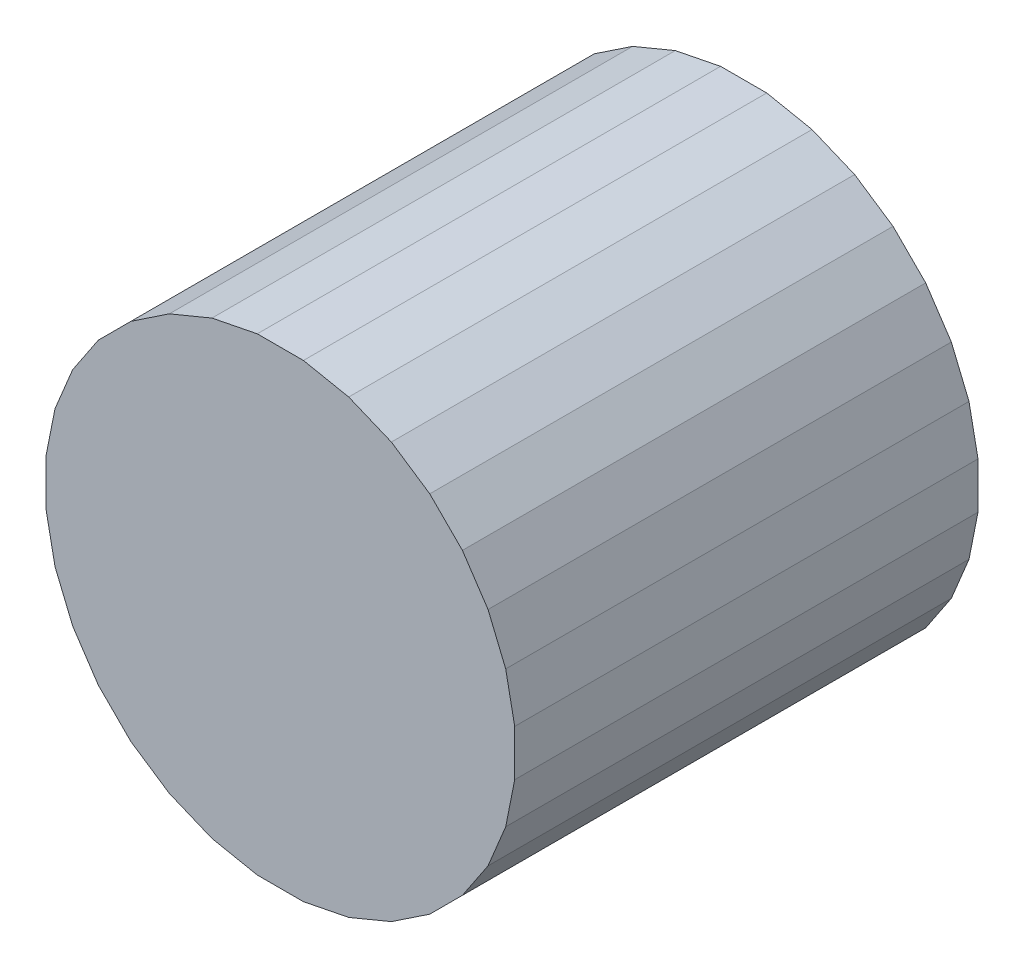
ISO-10303-21;
HEADER;
FILE_DESCRIPTION(('STEP AP214'),'2;1');
FILE_NAME('part.step','',(''),(''),'','','');
FILE_SCHEMA(('AUTOMOTIVE_DESIGN { 1 0 10303 214 1 1 1 1 }'));
ENDSEC;
DATA;
#1=APPLICATION_CONTEXT('core data for automotive mechanical design processes');
#2=APPLICATION_PROTOCOL_DEFINITION('international standard','automotive_design',2000,#1);
#3=PRODUCT_CONTEXT('',#1,'mechanical');
#4=PRODUCT('Part','Part','',(#3));
#5=PRODUCT_RELATED_PRODUCT_CATEGORY('part','',(#4));
#6=PRODUCT_DEFINITION_FORMATION('','',#4);
#7=PRODUCT_DEFINITION_CONTEXT('part definition',#1,'design');
#8=PRODUCT_DEFINITION('design','',#6,#7);
#9=PRODUCT_DEFINITION_SHAPE('','',#8);
#10=(LENGTH_UNIT() NAMED_UNIT(*) SI_UNIT(.MILLI.,.METRE.));
#11=(NAMED_UNIT(*) PLANE_ANGLE_UNIT() SI_UNIT($,.RADIAN.));
#12=(NAMED_UNIT(*) SI_UNIT($,.STERADIAN.) SOLID_ANGLE_UNIT());
#13=UNCERTAINTY_MEASURE_WITH_UNIT(LENGTH_MEASURE(1.E-05),#10,'distance_accuracy_value','');
#14=(GEOMETRIC_REPRESENTATION_CONTEXT(3) GLOBAL_UNCERTAINTY_ASSIGNED_CONTEXT((#13)) GLOBAL_UNIT_ASSIGNED_CONTEXT((#10,
#11,#12)) REPRESENTATION_CONTEXT('',''));
#15=CARTESIAN_POINT('',(0.,0.,0.));
#16=DIRECTION('',(0.,0.,1.));
#17=DIRECTION('',(1.,0.,0.));
#18=AXIS2_PLACEMENT_3D('',#15,#16,#17);
#19=CARTESIAN_POINT('',(0.15818358,1.606042,0.));
#20=DIRECTION('',(0.19508309397506,0.980786718122303,0.));
#21=DIRECTION('',(-0.980786718122303,0.19508309397506,0.));
#22=AXIS2_PLACEMENT_3D('',#19,#20,#21);
#23=PLANE('',#22);
#24=DIRECTION('',(0.,0.,1.));
#25=VECTOR('',#24,1.);
#26=CARTESIAN_POINT('',(0.46846744,1.54432508,0.));
#27=LINE('',#26,#25);
#28=CARTESIAN_POINT('',(0.468467440000009,1.54432508000005,0.));
#29=VERTEX_POINT('',#28);
#30=CARTESIAN_POINT('',(0.468467440000009,1.54432508000005,3.175));
#31=VERTEX_POINT('',#30);
#32=EDGE_CURVE('E243',#29,#31,#27,.T.);
#33=ORIENTED_EDGE('',*,*,#32,.F.);
#34=DIRECTION('',(-0.980786718122303,0.19508309397506,0.));
#35=VECTOR('',#34,1.);
#36=CARTESIAN_POINT('',(0.15818358,1.606042,0.));
#37=LINE('',#36,#35);
#38=CARTESIAN_POINT('',(0.15818358,1.606042,0.));
#39=VERTEX_POINT('',#38);
#40=EDGE_CURVE('E233',#29,#39,#37,.T.);
#41=ORIENTED_EDGE('',*,*,#40,.T.);
#42=DIRECTION('',(0.,0.,1.));
#43=VECTOR('',#42,1.);
#44=CARTESIAN_POINT('',(0.15818358,1.606042,0.));
#45=LINE('',#44,#43);
#46=CARTESIAN_POINT('',(0.15818358,1.606042,3.175));
#47=VERTEX_POINT('',#46);
#48=EDGE_CURVE('E20',#39,#47,#45,.T.);
#49=ORIENTED_EDGE('',*,*,#48,.T.);
#50=DIRECTION('',(-0.980786718122303,0.19508309397506,0.));
#51=VECTOR('',#50,1.);
#52=CARTESIAN_POINT('',(0.15818358,1.606042,3.175));
#53=LINE('',#52,#51);
#54=EDGE_CURVE('E236',#47,#31,#53,.F.);
#55=ORIENTED_EDGE('',*,*,#54,.T.);
#56=EDGE_LOOP('',(#33,#41,#49,#55));
#57=FACE_BOUND('',#56,.T.);
#58=ADVANCED_FACE('F17',(#57),#23,.T.);
#59=CARTESIAN_POINT('',(-0.15818104,1.606042,0.));
#60=DIRECTION('',(0.,1.,0.));
#61=DIRECTION('',(0.,0.,1.));
#62=AXIS2_PLACEMENT_3D('',#59,#60,#61);
#63=PLANE('',#62);
#64=DIRECTION('',(1.,0.,0.));
#65=VECTOR('',#64,1.);
#66=CARTESIAN_POINT('',(-0.15818104,1.606042,3.175));
#67=LINE('',#66,#65);
#68=CARTESIAN_POINT('',(-0.158181039999995,1.60604199999998,3.175));
#69=VERTEX_POINT('',#68);
#70=EDGE_CURVE('E225',#69,#47,#67,.T.);
#71=ORIENTED_EDGE('',*,*,#70,.T.);
#72=ORIENTED_EDGE('',*,*,#48,.F.);
#73=DIRECTION('',(1.,0.,0.));
#74=VECTOR('',#73,1.);
#75=CARTESIAN_POINT('',(-0.15818104,1.606042,0.));
#76=LINE('',#75,#74);
#77=CARTESIAN_POINT('',(-0.158181039999995,1.60604199999998,0.));
#78=VERTEX_POINT('',#77);
#79=EDGE_CURVE('E220',#39,#78,#76,.F.);
#80=ORIENTED_EDGE('',*,*,#79,.T.);
#81=DIRECTION('',(0.,0.,1.));
#82=VECTOR('',#81,1.);
#83=CARTESIAN_POINT('',(-0.158181039999982,1.60604199999991,0.));
#84=LINE('',#83,#82);
#85=EDGE_CURVE('E231',#69,#78,#84,.F.);
#86=ORIENTED_EDGE('',*,*,#85,.F.);
#87=EDGE_LOOP('',(#71,#72,#80,#86));
#88=FACE_BOUND('',#87,.T.);
#89=ADVANCED_FACE('F227',(#88),#63,.T.);
#90=CARTESIAN_POINT('',(0.46846744,1.54432508,0.));
#91=DIRECTION('',(0.38269049889006,0.923876605429144,0.));
#92=DIRECTION('',(-0.923876605429144,0.38269049889006,0.));
#93=AXIS2_PLACEMENT_3D('',#90,#91,#92);
#94=PLANE('',#93);
#95=DIRECTION('',(0.,0.,1.));
#96=VECTOR('',#95,1.);
#97=CARTESIAN_POINT('',(0.76074778,1.42325598,0.));
#98=LINE('',#97,#96);
#99=CARTESIAN_POINT('',(0.760747780000001,1.42325598,0.));
#100=VERTEX_POINT('',#99);
#101=CARTESIAN_POINT('',(0.760747780000001,1.42325598,3.175));
#102=VERTEX_POINT('',#101);
#103=EDGE_CURVE('E257',#100,#102,#98,.T.);
#104=ORIENTED_EDGE('',*,*,#103,.F.);
#105=DIRECTION('',(-0.923876605429144,0.38269049889006,0.));
#106=VECTOR('',#105,1.);
#107=CARTESIAN_POINT('',(0.46846744,1.54432508,0.));
#108=LINE('',#107,#106);
#109=EDGE_CURVE('E250',#100,#29,#108,.T.);
#110=ORIENTED_EDGE('',*,*,#109,.T.);
#111=ORIENTED_EDGE('',*,*,#32,.T.);
#112=DIRECTION('',(-0.923876605429144,0.38269049889006,0.));
#113=VECTOR('',#112,1.);
#114=CARTESIAN_POINT('',(0.46846744,1.54432508,3.175));
#115=LINE('',#114,#113);
#116=EDGE_CURVE('E239',#31,#102,#115,.F.);
#117=ORIENTED_EDGE('',*,*,#116,.T.);
#118=EDGE_LOOP('',(#104,#110,#111,#117));
#119=FACE_BOUND('',#118,.T.);
#120=ADVANCED_FACE('F538',(#119),#94,.T.);
#121=CARTESIAN_POINT('',(-0.4684649,1.54432508,0.));
#122=DIRECTION('',(-0.19508309397506,0.980786718122303,0.));
#123=DIRECTION('',(-0.980786718122303,-0.19508309397506,0.));
#124=AXIS2_PLACEMENT_3D('',#121,#122,#123);
#125=PLANE('',#124);
#126=ORIENTED_EDGE('',*,*,#85,.T.);
#127=DIRECTION('',(-0.980786718122303,-0.19508309397506,0.));
#128=VECTOR('',#127,1.);
#129=CARTESIAN_POINT('',(-0.4684649,1.54432508,0.));
#130=LINE('',#129,#128);
#131=CARTESIAN_POINT('',(-0.4684649,1.54432508,0.));
#132=VERTEX_POINT('',#131);
#133=EDGE_CURVE('E255',#78,#132,#130,.T.);
#134=ORIENTED_EDGE('',*,*,#133,.T.);
#135=DIRECTION('',(0.,0.,1.));
#136=VECTOR('',#135,1.);
#137=CARTESIAN_POINT('',(-0.468464899999998,1.54432508,0.));
#138=LINE('',#137,#136);
#139=CARTESIAN_POINT('',(-0.4684649,1.54432508,3.175));
#140=VERTEX_POINT('',#139);
#141=EDGE_CURVE('E268',#140,#132,#138,.F.);
#142=ORIENTED_EDGE('',*,*,#141,.F.);
#143=DIRECTION('',(-0.980786718122303,-0.19508309397506,0.));
#144=VECTOR('',#143,1.);
#145=CARTESIAN_POINT('',(-0.4684649,1.54432508,3.175));
#146=LINE('',#145,#144);
#147=EDGE_CURVE('E252',#140,#69,#146,.F.);
#148=ORIENTED_EDGE('',*,*,#147,.T.);
#149=EDGE_LOOP('',(#126,#134,#142,#148));
#150=FACE_BOUND('',#149,.T.);
#151=ADVANCED_FACE('F540',(#150),#125,.T.);
#152=CARTESIAN_POINT('',(0.76074778,1.42325598,0.));
#153=DIRECTION('',(0.55556885689429,0.831470531798435,0.));
#154=DIRECTION('',(-0.831470531798435,0.55556885689429,0.));
#155=AXIS2_PLACEMENT_3D('',#152,#153,#154);
#156=PLANE('',#155);
#157=DIRECTION('',(0.,0.,1.));
#158=VECTOR('',#157,1.);
#159=CARTESIAN_POINT('',(1.02379272,1.2474956,0.));
#160=LINE('',#159,#158);
#161=CARTESIAN_POINT('',(1.02379272000002,1.24749560000003,0.));
#162=VERTEX_POINT('',#161);
#163=CARTESIAN_POINT('',(1.02379272000002,1.24749560000003,3.175));
#164=VERTEX_POINT('',#163);
#165=EDGE_CURVE('E273',#162,#164,#160,.T.);
#166=ORIENTED_EDGE('',*,*,#165,.F.);
#167=DIRECTION('',(-0.831470531798435,0.55556885689429,0.));
#168=VECTOR('',#167,1.);
#169=CARTESIAN_POINT('',(0.76074778,1.42325598,0.));
#170=LINE('',#169,#168);
#171=EDGE_CURVE('E262',#162,#100,#170,.T.);
#172=ORIENTED_EDGE('',*,*,#171,.T.);
#173=ORIENTED_EDGE('',*,*,#103,.T.);
#174=DIRECTION('',(-0.831470531798435,0.55556885689429,0.));
#175=VECTOR('',#174,1.);
#176=CARTESIAN_POINT('',(0.76074778,1.42325598,3.175));
#177=LINE('',#176,#175);
#178=EDGE_CURVE('E260',#102,#164,#177,.F.);
#179=ORIENTED_EDGE('',*,*,#178,.T.);
#180=EDGE_LOOP('',(#166,#172,#173,#179));
#181=FACE_BOUND('',#180,.T.);
#182=ADVANCED_FACE('F535',(#181),#156,.T.);
#183=CARTESIAN_POINT('',(-0.76074524,1.42325598,0.));
#184=DIRECTION('',(-0.38269049889006,0.923876605429144,0.));
#185=DIRECTION('',(-0.923876605429144,-0.38269049889006,0.));
#186=AXIS2_PLACEMENT_3D('',#183,#184,#185);
#187=PLANE('',#186);
#188=ORIENTED_EDGE('',*,*,#141,.T.);
#189=DIRECTION('',(-0.923876605429144,-0.38269049889006,0.));
#190=VECTOR('',#189,1.);
#191=CARTESIAN_POINT('',(-0.76074524,1.42325598,0.));
#192=LINE('',#191,#190);
#193=CARTESIAN_POINT('',(-0.760745239999991,1.42325597999999,0.));
#194=VERTEX_POINT('',#193);
#195=EDGE_CURVE('E271',#132,#194,#192,.T.);
#196=ORIENTED_EDGE('',*,*,#195,.T.);
#197=DIRECTION('',(0.,0.,1.));
#198=VECTOR('',#197,1.);
#199=CARTESIAN_POINT('',(-0.760745239999962,1.42325597999994,0.));
#200=LINE('',#199,#198);
#201=CARTESIAN_POINT('',(-0.76074523999999,1.42325597999999,3.175));
#202=VERTEX_POINT('',#201);
#203=EDGE_CURVE('E284',#202,#194,#200,.F.);
#204=ORIENTED_EDGE('',*,*,#203,.F.);
#205=DIRECTION('',(-0.923876605429144,-0.38269049889006,0.));
#206=VECTOR('',#205,1.);
#207=CARTESIAN_POINT('',(-0.76074524,1.42325598,3.175));
#208=LINE('',#207,#206);
#209=EDGE_CURVE('E265',#202,#140,#208,.F.);
#210=ORIENTED_EDGE('',*,*,#209,.T.);
#211=EDGE_LOOP('',(#188,#196,#204,#210));
#212=FACE_BOUND('',#211,.T.);
#213=ADVANCED_FACE('F634',(#212),#187,.T.);
#214=CARTESIAN_POINT('',(1.02379272,1.2474956,0.));
#215=DIRECTION('',(0.707106781186548,0.707106781186548,0.));
#216=DIRECTION('',(-0.707106781186548,0.707106781186548,0.));
#217=AXIS2_PLACEMENT_3D('',#214,#215,#216);
#218=PLANE('',#217);
#219=DIRECTION('',(0.,0.,1.));
#220=VECTOR('',#219,1.);
#221=CARTESIAN_POINT('',(1.2474956,1.02379272,0.));
#222=LINE('',#221,#220);
#223=CARTESIAN_POINT('',(1.2474956,1.02379272,0.));
#224=VERTEX_POINT('',#223);
#225=CARTESIAN_POINT('',(1.2474956,1.02379272,3.175));
#226=VERTEX_POINT('',#225);
#227=EDGE_CURVE('E289',#224,#226,#222,.T.);
#228=ORIENTED_EDGE('',*,*,#227,.F.);
#229=DIRECTION('',(-0.707106781186548,0.707106781186548,0.));
#230=VECTOR('',#229,1.);
#231=CARTESIAN_POINT('',(1.02379272,1.2474956,0.));
#232=LINE('',#231,#230);
#233=EDGE_CURVE('E278',#224,#162,#232,.T.);
#234=ORIENTED_EDGE('',*,*,#233,.T.);
#235=ORIENTED_EDGE('',*,*,#165,.T.);
#236=DIRECTION('',(-0.707106781186548,0.707106781186548,0.));
#237=VECTOR('',#236,1.);
#238=CARTESIAN_POINT('',(1.02379272,1.2474956,3.175));
#239=LINE('',#238,#237);
#240=EDGE_CURVE('E276',#164,#226,#239,.F.);
#241=ORIENTED_EDGE('',*,*,#240,.T.);
#242=EDGE_LOOP('',(#228,#234,#235,#241));
#243=FACE_BOUND('',#242,.T.);
#244=ADVANCED_FACE('F532',(#243),#218,.T.);
#245=CARTESIAN_POINT('',(-1.02379018,1.2474956,0.));
#246=DIRECTION('',(-0.55556885689429,0.831470531798435,0.));
#247=DIRECTION('',(-0.831470531798435,-0.55556885689429,0.));
#248=AXIS2_PLACEMENT_3D('',#245,#246,#247);
#249=PLANE('',#248);
#250=ORIENTED_EDGE('',*,*,#203,.T.);
#251=DIRECTION('',(-0.831470531798435,-0.55556885689429,0.));
#252=VECTOR('',#251,1.);
#253=CARTESIAN_POINT('',(-1.02379018,1.2474956,0.));
#254=LINE('',#253,#252);
#255=CARTESIAN_POINT('',(-1.02379018,1.2474956,0.));
#256=VERTEX_POINT('',#255);
#257=EDGE_CURVE('E287',#194,#256,#254,.T.);
#258=ORIENTED_EDGE('',*,*,#257,.T.);
#259=DIRECTION('',(0.,0.,1.));
#260=VECTOR('',#259,1.);
#261=CARTESIAN_POINT('',(-1.02379018,1.2474956,0.));
#262=LINE('',#261,#260);
#263=CARTESIAN_POINT('',(-1.02379018,1.2474956,3.175));
#264=VERTEX_POINT('',#263);
#265=EDGE_CURVE('E300',#264,#256,#262,.F.);
#266=ORIENTED_EDGE('',*,*,#265,.F.);
#267=DIRECTION('',(-0.831470531798435,-0.55556885689429,0.));
#268=VECTOR('',#267,1.);
#269=CARTESIAN_POINT('',(-1.02379018,1.2474956,3.175));
#270=LINE('',#269,#268);
#271=EDGE_CURVE('E281',#264,#202,#270,.F.);
#272=ORIENTED_EDGE('',*,*,#271,.T.);
#273=EDGE_LOOP('',(#250,#258,#266,#272));
#274=FACE_BOUND('',#273,.T.);
#275=ADVANCED_FACE('F628',(#274),#249,.T.);
#276=CARTESIAN_POINT('',(1.2474956,1.02379272,0.));
#277=DIRECTION('',(0.831470531798435,0.55556885689429,0.));
#278=DIRECTION('',(-0.55556885689429,0.831470531798435,0.));
#279=AXIS2_PLACEMENT_3D('',#276,#277,#278);
#280=PLANE('',#279);
#281=DIRECTION('',(0.,0.,1.));
#282=VECTOR('',#281,1.);
#283=CARTESIAN_POINT('',(1.42325598,0.76074778,0.));
#284=LINE('',#283,#282);
#285=CARTESIAN_POINT('',(1.42325597999997,0.760747779999981,0.));
#286=VERTEX_POINT('',#285);
#287=CARTESIAN_POINT('',(1.42325597999997,0.760747779999981,3.175));
#288=VERTEX_POINT('',#287);
#289=EDGE_CURVE('E305',#286,#288,#284,.T.);
#290=ORIENTED_EDGE('',*,*,#289,.F.);
#291=DIRECTION('',(-0.55556885689429,0.831470531798435,0.));
#292=VECTOR('',#291,1.);
#293=CARTESIAN_POINT('',(1.2474956,1.02379272,0.));
#294=LINE('',#293,#292);
#295=EDGE_CURVE('E294',#286,#224,#294,.T.);
#296=ORIENTED_EDGE('',*,*,#295,.T.);
#297=ORIENTED_EDGE('',*,*,#227,.T.);
#298=DIRECTION('',(-0.55556885689429,0.831470531798435,0.));
#299=VECTOR('',#298,1.);
#300=CARTESIAN_POINT('',(1.2474956,1.02379272,3.175));
#301=LINE('',#300,#299);
#302=EDGE_CURVE('E292',#226,#288,#301,.F.);
#303=ORIENTED_EDGE('',*,*,#302,.T.);
#304=EDGE_LOOP('',(#290,#296,#297,#303));
#305=FACE_BOUND('',#304,.T.);
#306=ADVANCED_FACE('F530',(#305),#280,.T.);
#307=CARTESIAN_POINT('',(-1.24749306,1.02379272,0.));
#308=DIRECTION('',(-0.707106781186548,0.707106781186548,0.));
#309=DIRECTION('',(-0.707106781186548,-0.707106781186548,0.));
#310=AXIS2_PLACEMENT_3D('',#307,#308,#309);
#311=PLANE('',#310);
#312=ORIENTED_EDGE('',*,*,#265,.T.);
#313=DIRECTION('',(-0.707106781186548,-0.707106781186548,0.));
#314=VECTOR('',#313,1.);
#315=CARTESIAN_POINT('',(-1.24749306,1.02379272,0.));
#316=LINE('',#315,#314);
#317=CARTESIAN_POINT('',(-1.24749306000001,1.02379272000001,0.));
#318=VERTEX_POINT('',#317);
#319=EDGE_CURVE('E303',#256,#318,#316,.T.);
#320=ORIENTED_EDGE('',*,*,#319,.T.);
#321=DIRECTION('',(0.,0.,1.));
#322=VECTOR('',#321,1.);
#323=CARTESIAN_POINT('',(-1.24749306000006,1.02379272000004,0.));
#324=LINE('',#323,#322);
#325=CARTESIAN_POINT('',(-1.24749306000001,1.02379272000001,3.175));
#326=VERTEX_POINT('',#325);
#327=EDGE_CURVE('E316',#326,#318,#324,.F.);
#328=ORIENTED_EDGE('',*,*,#327,.F.);
#329=DIRECTION('',(-0.707106781186548,-0.707106781186548,0.));
#330=VECTOR('',#329,1.);
#331=CARTESIAN_POINT('',(-1.24749306,1.02379272,3.175));
#332=LINE('',#331,#330);
#333=EDGE_CURVE('E297',#326,#264,#332,.F.);
#334=ORIENTED_EDGE('',*,*,#333,.T.);
#335=EDGE_LOOP('',(#312,#320,#328,#334));
#336=FACE_BOUND('',#335,.T.);
#337=ADVANCED_FACE('F622',(#336),#311,.T.);
#338=CARTESIAN_POINT('',(1.42325598,0.76074778,0.));
#339=DIRECTION('',(0.923876605429144,0.38269049889006,0.));
#340=DIRECTION('',(-0.38269049889006,0.923876605429144,0.));
#341=AXIS2_PLACEMENT_3D('',#338,#339,#340);
#342=PLANE('',#341);
#343=DIRECTION('',(0.,0.,1.));
#344=VECTOR('',#343,1.);
#345=CARTESIAN_POINT('',(1.54432508,0.46846744,0.));
#346=LINE('',#345,#344);
#347=CARTESIAN_POINT('',(1.54432508,0.468467439999998,0.));
#348=VERTEX_POINT('',#347);
#349=CARTESIAN_POINT('',(1.54432508,0.468467439999998,3.175));
#350=VERTEX_POINT('',#349);
#351=EDGE_CURVE('E321',#348,#350,#346,.T.);
#352=ORIENTED_EDGE('',*,*,#351,.F.);
#353=DIRECTION('',(-0.38269049889006,0.923876605429144,0.));
#354=VECTOR('',#353,1.);
#355=CARTESIAN_POINT('',(1.42325598,0.76074778,0.));
#356=LINE('',#355,#354);
#357=EDGE_CURVE('E310',#348,#286,#356,.T.);
#358=ORIENTED_EDGE('',*,*,#357,.T.);
#359=ORIENTED_EDGE('',*,*,#289,.T.);
#360=DIRECTION('',(-0.38269049889006,0.923876605429144,0.));
#361=VECTOR('',#360,1.);
#362=CARTESIAN_POINT('',(1.42325598,0.76074778,3.175));
#363=LINE('',#362,#361);
#364=EDGE_CURVE('E308',#288,#350,#363,.F.);
#365=ORIENTED_EDGE('',*,*,#364,.T.);
#366=EDGE_LOOP('',(#352,#358,#359,#365));
#367=FACE_BOUND('',#366,.T.);
#368=ADVANCED_FACE('F525',(#367),#342,.T.);
#369=CARTESIAN_POINT('',(-1.42325344,0.76074778,0.));
#370=DIRECTION('',(-0.831470531798435,0.55556885689429,0.));
#371=DIRECTION('',(-0.55556885689429,-0.831470531798435,0.));
#372=AXIS2_PLACEMENT_3D('',#369,#370,#371);
#373=PLANE('',#372);
#374=ORIENTED_EDGE('',*,*,#327,.T.);
#375=DIRECTION('',(-0.55556885689429,-0.831470531798435,0.));
#376=VECTOR('',#375,1.);
#377=CARTESIAN_POINT('',(-1.42325344,0.76074778,0.));
#378=LINE('',#377,#376);
#379=CARTESIAN_POINT('',(-1.42325344,0.760747780000001,0.));
#380=VERTEX_POINT('',#379);
#381=EDGE_CURVE('E319',#318,#380,#378,.T.);
#382=ORIENTED_EDGE('',*,*,#381,.T.);
#383=DIRECTION('',(0.,0.,1.));
#384=VECTOR('',#383,1.);
#385=CARTESIAN_POINT('',(-1.42325344,0.760747780000002,0.));
#386=LINE('',#385,#384);
#387=CARTESIAN_POINT('',(-1.42325344,0.760747780000001,3.175));
#388=VERTEX_POINT('',#387);
#389=EDGE_CURVE('E333',#388,#380,#386,.F.);
#390=ORIENTED_EDGE('',*,*,#389,.F.);
#391=DIRECTION('',(-0.55556885689429,-0.831470531798435,0.));
#392=VECTOR('',#391,1.);
#393=CARTESIAN_POINT('',(-1.42325344,0.76074778,3.175));
#394=LINE('',#393,#392);
#395=EDGE_CURVE('E313',#388,#326,#394,.F.);
#396=ORIENTED_EDGE('',*,*,#395,.T.);
#397=EDGE_LOOP('',(#374,#382,#390,#396));
#398=FACE_BOUND('',#397,.T.);
#399=ADVANCED_FACE('F616',(#398),#373,.T.);
#400=CARTESIAN_POINT('',(1.54432508,0.46846744,0.));
#401=DIRECTION('',(0.980786718122303,0.19508309397506,0.));
#402=DIRECTION('',(-0.19508309397506,0.980786718122303,0.));
#403=AXIS2_PLACEMENT_3D('',#400,#401,#402);
#404=PLANE('',#403);
#405=DIRECTION('',(0.,0.,-1.));
#406=VECTOR('',#405,1.);
#407=CARTESIAN_POINT('',(1.606042,0.15818358,0.));
#408=LINE('',#407,#406);
#409=CARTESIAN_POINT('',(1.60604199999995,0.158183579999991,0.));
#410=VERTEX_POINT('',#409);
#411=CARTESIAN_POINT('',(1.60604199999995,0.158183579999991,3.175));
#412=VERTEX_POINT('',#411);
#413=EDGE_CURVE('E338',#410,#412,#408,.F.);
#414=ORIENTED_EDGE('',*,*,#413,.F.);
#415=DIRECTION('',(-0.19508309397506,0.980786718122303,0.));
#416=VECTOR('',#415,1.);
#417=CARTESIAN_POINT('',(1.54432508,0.46846744,0.));
#418=LINE('',#417,#416);
#419=EDGE_CURVE('E327',#410,#348,#418,.T.);
#420=ORIENTED_EDGE('',*,*,#419,.T.);
#421=ORIENTED_EDGE('',*,*,#351,.T.);
#422=DIRECTION('',(-0.19508309397506,0.980786718122303,0.));
#423=VECTOR('',#422,1.);
#424=CARTESIAN_POINT('',(1.54432508,0.46846744,3.175));
#425=LINE('',#424,#423);
#426=EDGE_CURVE('E324',#350,#412,#425,.F.);
#427=ORIENTED_EDGE('',*,*,#426,.T.);
#428=EDGE_LOOP('',(#414,#420,#421,#427));
#429=FACE_BOUND('',#428,.T.);
#430=ADVANCED_FACE('F519',(#429),#404,.T.);
#431=CARTESIAN_POINT('',(-1.54432254,0.46846744,0.));
#432=DIRECTION('',(-0.923876605429144,0.38269049889006,0.));
#433=DIRECTION('',(-0.38269049889006,-0.923876605429144,0.));
#434=AXIS2_PLACEMENT_3D('',#431,#432,#433);
#435=PLANE('',#434);
#436=ORIENTED_EDGE('',*,*,#389,.T.);
#437=DIRECTION('',(-0.38269049889006,-0.923876605429144,0.));
#438=VECTOR('',#437,1.);
#439=CARTESIAN_POINT('',(-1.54432254,0.46846744,0.));
#440=LINE('',#439,#438);
#441=CARTESIAN_POINT('',(-1.54432253999997,0.468467439999994,0.));
#442=VERTEX_POINT('',#441);
#443=EDGE_CURVE('E336',#380,#442,#440,.T.);
#444=ORIENTED_EDGE('',*,*,#443,.T.);
#445=DIRECTION('',(0.,0.,1.));
#446=VECTOR('',#445,1.);
#447=CARTESIAN_POINT('',(-1.54432253999988,0.468467439999975,0.));
#448=LINE('',#447,#446);
#449=CARTESIAN_POINT('',(-1.54432253999997,0.468467439999993,3.175));
#450=VERTEX_POINT('',#449);
#451=EDGE_CURVE('E344',#450,#442,#448,.F.);
#452=ORIENTED_EDGE('',*,*,#451,.F.);
#453=DIRECTION('',(-0.38269049889006,-0.923876605429144,0.));
#454=VECTOR('',#453,1.);
#455=CARTESIAN_POINT('',(-1.54432254,0.46846744,3.175));
#456=LINE('',#455,#454);
#457=EDGE_CURVE('E330',#450,#388,#456,.F.);
#458=ORIENTED_EDGE('',*,*,#457,.T.);
#459=EDGE_LOOP('',(#436,#444,#452,#458));
#460=FACE_BOUND('',#459,.T.);
#461=ADVANCED_FACE('F609',(#460),#435,.T.);
#462=CARTESIAN_POINT('',(-1.606042,0.15818358,0.));
#463=DIRECTION('',(-0.980785181909882,0.195090817174977,0.));
#464=DIRECTION('',(-0.195090817174977,-0.980785181909882,0.));
#465=AXIS2_PLACEMENT_3D('',#462,#463,#464);
#466=PLANE('',#465);
#467=ORIENTED_EDGE('',*,*,#451,.T.);
#468=DIRECTION('',(-0.195090817174977,-0.980785181909882,0.));
#469=VECTOR('',#468,1.);
#470=CARTESIAN_POINT('',(-1.606042,0.15818358,0.));
#471=LINE('',#470,#469);
#472=CARTESIAN_POINT('',(-1.606042,0.15818358,0.));
#473=VERTEX_POINT('',#472);
#474=EDGE_CURVE('E347',#442,#473,#471,.T.);
#475=ORIENTED_EDGE('',*,*,#474,.T.);
#476=DIRECTION('',(0.,0.,1.));
#477=VECTOR('',#476,1.);
#478=CARTESIAN_POINT('',(-1.606042,0.15818358,0.));
#479=LINE('',#478,#477);
#480=CARTESIAN_POINT('',(-1.606042,0.158183580000001,3.175));
#481=VERTEX_POINT('',#480);
#482=EDGE_CURVE('E354',#481,#473,#479,.F.);
#483=ORIENTED_EDGE('',*,*,#482,.F.);
#484=DIRECTION('',(-0.195090817174977,-0.980785181909882,0.));
#485=VECTOR('',#484,1.);
#486=CARTESIAN_POINT('',(-1.606042,0.15818358,3.175));
#487=LINE('',#486,#485);
#488=EDGE_CURVE('E341',#481,#450,#487,.F.);
#489=ORIENTED_EDGE('',*,*,#488,.T.);
#490=EDGE_LOOP('',(#467,#475,#483,#489));
#491=FACE_BOUND('',#490,.T.);
#492=ADVANCED_FACE('F606',(#491),#466,.T.);
#493=CARTESIAN_POINT('',(1.606042,0.,0.));
#494=DIRECTION('',(1.,0.,0.));
#495=DIRECTION('',(0.,0.,-1.));
#496=AXIS2_PLACEMENT_3D('',#493,#494,#495);
#497=PLANE('',#496);
#498=DIRECTION('',(0.,0.,1.));
#499=VECTOR('',#498,1.);
#500=CARTESIAN_POINT('',(1.606042,-0.15818104,0.));
#501=LINE('',#500,#499);
#502=CARTESIAN_POINT('',(1.606042,-0.15818104,0.));
#503=VERTEX_POINT('',#502);
#504=CARTESIAN_POINT('',(1.606042,-0.15818104,3.175));
#505=VERTEX_POINT('',#504);
#506=EDGE_CURVE('E357',#503,#505,#501,.T.);
#507=ORIENTED_EDGE('',*,*,#506,.F.);
#508=DIRECTION('',(0.,1.,0.));
#509=VECTOR('',#508,1.);
#510=CARTESIAN_POINT('',(1.606042,0.,0.));
#511=LINE('',#510,#509);
#512=EDGE_CURVE('E352',#503,#410,#511,.T.);
#513=ORIENTED_EDGE('',*,*,#512,.T.);
#514=ORIENTED_EDGE('',*,*,#413,.T.);
#515=DIRECTION('',(0.,1.,0.));
#516=VECTOR('',#515,1.);
#517=CARTESIAN_POINT('',(1.606042,0.,3.175));
#518=LINE('',#517,#516);
#519=EDGE_CURVE('E350',#412,#505,#518,.F.);
#520=ORIENTED_EDGE('',*,*,#519,.T.);
#521=EDGE_LOOP('',(#507,#513,#514,#520));
#522=FACE_BOUND('',#521,.T.);
#523=ADVANCED_FACE('F521',(#522),#497,.T.);
#524=CARTESIAN_POINT('',(1.606042,-0.15818104,0.));
#525=DIRECTION('',(0.980786718122303,-0.19508309397506,0.));
#526=DIRECTION('',(0.19508309397506,0.980786718122303,0.));
#527=AXIS2_PLACEMENT_3D('',#524,#525,#526);
#528=PLANE('',#527);
#529=DIRECTION('',(0.,0.,1.));
#530=VECTOR('',#529,1.);
#531=CARTESIAN_POINT('',(1.54432508,-0.4684649,0.));
#532=LINE('',#531,#530);
#533=CARTESIAN_POINT('',(1.54432508000005,-0.468464900000009,0.));
#534=VERTEX_POINT('',#533);
#535=CARTESIAN_POINT('',(1.54432508000005,-0.468464900000009,3.175));
#536=VERTEX_POINT('',#535);
#537=EDGE_CURVE('E369',#534,#536,#532,.T.);
#538=ORIENTED_EDGE('',*,*,#537,.F.);
#539=DIRECTION('',(0.19508309397506,0.980786718122303,0.));
#540=VECTOR('',#539,1.);
#541=CARTESIAN_POINT('',(1.606042,-0.15818104,0.));
#542=LINE('',#541,#540);
#543=EDGE_CURVE('E362',#534,#503,#542,.T.);
#544=ORIENTED_EDGE('',*,*,#543,.T.);
#545=ORIENTED_EDGE('',*,*,#506,.T.);
#546=DIRECTION('',(0.19508309397506,0.980786718122303,0.));
#547=VECTOR('',#546,1.);
#548=CARTESIAN_POINT('',(1.606042,-0.15818104,3.175));
#549=LINE('',#548,#547);
#550=EDGE_CURVE('E360',#505,#536,#549,.F.);
#551=ORIENTED_EDGE('',*,*,#550,.T.);
#552=EDGE_LOOP('',(#538,#544,#545,#551));
#553=FACE_BOUND('',#552,.T.);
#554=ADVANCED_FACE('F512',(#553),#528,.T.);
#555=CARTESIAN_POINT('',(-1.606042,-0.15818104,0.));
#556=DIRECTION('',(-1.,0.,0.));
#557=DIRECTION('',(0.,0.,1.));
#558=AXIS2_PLACEMENT_3D('',#555,#556,#557);
#559=PLANE('',#558);
#560=DIRECTION('',(0.,1.,0.));
#561=VECTOR('',#560,1.);
#562=CARTESIAN_POINT('',(-1.606042,-0.15818104,3.175));
#563=LINE('',#562,#561);
#564=CARTESIAN_POINT('',(-1.60604200000003,-0.158181040000007,3.175));
#565=VERTEX_POINT('',#564);
#566=EDGE_CURVE('E365',#565,#481,#563,.T.);
#567=ORIENTED_EDGE('',*,*,#566,.T.);
#568=ORIENTED_EDGE('',*,*,#482,.T.);
#569=DIRECTION('',(0.,1.,0.));
#570=VECTOR('',#569,1.);
#571=CARTESIAN_POINT('',(-1.606042,-0.15818104,0.));
#572=LINE('',#571,#570);
#573=CARTESIAN_POINT('',(-1.60604200000003,-0.158181040000007,0.));
#574=VERTEX_POINT('',#573);
#575=EDGE_CURVE('E367',#473,#574,#572,.F.);
#576=ORIENTED_EDGE('',*,*,#575,.T.);
#577=DIRECTION('',(0.,0.,1.));
#578=VECTOR('',#577,1.);
#579=CARTESIAN_POINT('',(-1.60604200000012,-0.158181040000025,0.));
#580=LINE('',#579,#578);
#581=EDGE_CURVE('E380',#565,#574,#580,.F.);
#582=ORIENTED_EDGE('',*,*,#581,.F.);
#583=EDGE_LOOP('',(#567,#568,#576,#582));
#584=FACE_BOUND('',#583,.T.);
#585=ADVANCED_FACE('F598',(#584),#559,.T.);
#586=CARTESIAN_POINT('',(1.54432508,-0.4684649,0.));
#587=DIRECTION('',(0.923876605429144,-0.38269049889006,0.));
#588=DIRECTION('',(0.38269049889006,0.923876605429144,0.));
#589=AXIS2_PLACEMENT_3D('',#586,#587,#588);
#590=PLANE('',#589);
#591=DIRECTION('',(0.,0.,1.));
#592=VECTOR('',#591,1.);
#593=CARTESIAN_POINT('',(1.42325598,-0.76074524,0.));
#594=LINE('',#593,#592);
#595=CARTESIAN_POINT('',(1.42325598,-0.760745240000001,0.));
#596=VERTEX_POINT('',#595);
#597=CARTESIAN_POINT('',(1.42325598,-0.760745240000001,3.175));
#598=VERTEX_POINT('',#597);
#599=EDGE_CURVE('E385',#596,#598,#594,.T.);
#600=ORIENTED_EDGE('',*,*,#599,.F.);
#601=DIRECTION('',(0.38269049889006,0.923876605429144,0.));
#602=VECTOR('',#601,1.);
#603=CARTESIAN_POINT('',(1.54432508,-0.4684649,0.));
#604=LINE('',#603,#602);
#605=EDGE_CURVE('E374',#596,#534,#604,.T.);
#606=ORIENTED_EDGE('',*,*,#605,.T.);
#607=ORIENTED_EDGE('',*,*,#537,.T.);
#608=DIRECTION('',(0.38269049889006,0.923876605429144,0.));
#609=VECTOR('',#608,1.);
#610=CARTESIAN_POINT('',(1.54432508,-0.4684649,3.175));
#611=LINE('',#610,#609);
#612=EDGE_CURVE('E372',#536,#598,#611,.F.);
#613=ORIENTED_EDGE('',*,*,#612,.T.);
#614=EDGE_LOOP('',(#600,#606,#607,#613));
#615=FACE_BOUND('',#614,.T.);
#616=ADVANCED_FACE('F509',(#615),#590,.T.);
#617=CARTESIAN_POINT('',(-1.54432254,-0.4684649,0.));
#618=DIRECTION('',(-0.980785181909882,-0.195090817174977,0.));
#619=DIRECTION('',(0.195090817174977,-0.980785181909882,0.));
#620=AXIS2_PLACEMENT_3D('',#617,#618,#619);
#621=PLANE('',#620);
#622=ORIENTED_EDGE('',*,*,#581,.T.);
#623=DIRECTION('',(0.195090817174977,-0.980785181909882,0.));
#624=VECTOR('',#623,1.);
#625=CARTESIAN_POINT('',(-1.54432254,-0.4684649,0.));
#626=LINE('',#625,#624);
#627=CARTESIAN_POINT('',(-1.54432254,-0.4684649,0.));
#628=VERTEX_POINT('',#627);
#629=EDGE_CURVE('E383',#574,#628,#626,.T.);
#630=ORIENTED_EDGE('',*,*,#629,.T.);
#631=DIRECTION('',(0.,0.,1.));
#632=VECTOR('',#631,1.);
#633=CARTESIAN_POINT('',(-1.54432254,-0.468464899999998,0.));
#634=LINE('',#633,#632);
#635=CARTESIAN_POINT('',(-1.54432254,-0.4684649,3.175));
#636=VERTEX_POINT('',#635);
#637=EDGE_CURVE('E396',#636,#628,#634,.F.);
#638=ORIENTED_EDGE('',*,*,#637,.F.);
#639=DIRECTION('',(0.195090817174977,-0.980785181909882,0.));
#640=VECTOR('',#639,1.);
#641=CARTESIAN_POINT('',(-1.54432254,-0.4684649,3.175));
#642=LINE('',#641,#640);
#643=EDGE_CURVE('E377',#636,#565,#642,.F.);
#644=ORIENTED_EDGE('',*,*,#643,.T.);
#645=EDGE_LOOP('',(#622,#630,#638,#644));
#646=FACE_BOUND('',#645,.T.);
#647=ADVANCED_FACE('F592',(#646),#621,.T.);
#648=CARTESIAN_POINT('',(1.42325598,-0.76074524,0.));
#649=DIRECTION('',(0.831470531798435,-0.55556885689429,0.));
#650=DIRECTION('',(0.55556885689429,0.831470531798435,0.));
#651=AXIS2_PLACEMENT_3D('',#648,#649,#650);
#652=PLANE('',#651);
#653=DIRECTION('',(0.,0.,1.));
#654=VECTOR('',#653,1.);
#655=CARTESIAN_POINT('',(1.2474956,-1.02379018,0.));
#656=LINE('',#655,#654);
#657=CARTESIAN_POINT('',(1.24749560000003,-1.02379018000002,0.));
#658=VERTEX_POINT('',#657);
#659=CARTESIAN_POINT('',(1.24749560000003,-1.02379018000002,3.175));
#660=VERTEX_POINT('',#659);
#661=EDGE_CURVE('E401',#658,#660,#656,.T.);
#662=ORIENTED_EDGE('',*,*,#661,.F.);
#663=DIRECTION('',(0.55556885689429,0.831470531798435,0.));
#664=VECTOR('',#663,1.);
#665=CARTESIAN_POINT('',(1.42325598,-0.76074524,0.));
#666=LINE('',#665,#664);
#667=EDGE_CURVE('E390',#658,#596,#666,.T.);
#668=ORIENTED_EDGE('',*,*,#667,.T.);
#669=ORIENTED_EDGE('',*,*,#599,.T.);
#670=DIRECTION('',(0.55556885689429,0.831470531798435,0.));
#671=VECTOR('',#670,1.);
#672=CARTESIAN_POINT('',(1.42325598,-0.76074524,3.175));
#673=LINE('',#672,#671);
#674=EDGE_CURVE('E388',#598,#660,#673,.F.);
#675=ORIENTED_EDGE('',*,*,#674,.T.);
#676=EDGE_LOOP('',(#662,#668,#669,#675));
#677=FACE_BOUND('',#676,.T.);
#678=ADVANCED_FACE('F507',(#677),#652,.T.);
#679=CARTESIAN_POINT('',(-1.42325344,-0.76074524,0.));
#680=DIRECTION('',(-0.923876605429144,-0.38269049889006,0.));
#681=DIRECTION('',(0.38269049889006,-0.923876605429144,0.));
#682=AXIS2_PLACEMENT_3D('',#679,#680,#681);
#683=PLANE('',#682);
#684=ORIENTED_EDGE('',*,*,#637,.T.);
#685=DIRECTION('',(0.38269049889006,-0.923876605429144,0.));
#686=VECTOR('',#685,1.);
#687=CARTESIAN_POINT('',(-1.42325344,-0.76074524,0.));
#688=LINE('',#687,#686);
#689=CARTESIAN_POINT('',(-1.42325343999999,-0.760745239999991,0.));
#690=VERTEX_POINT('',#689);
#691=EDGE_CURVE('E399',#628,#690,#688,.T.);
#692=ORIENTED_EDGE('',*,*,#691,.T.);
#693=DIRECTION('',(0.,0.,1.));
#694=VECTOR('',#693,1.);
#695=CARTESIAN_POINT('',(-1.42325343999994,-0.760745239999962,0.));
#696=LINE('',#695,#694);
#697=CARTESIAN_POINT('',(-1.42325343999999,-0.760745239999992,3.175));
#698=VERTEX_POINT('',#697);
#699=EDGE_CURVE('E412',#698,#690,#696,.F.);
#700=ORIENTED_EDGE('',*,*,#699,.F.);
#701=DIRECTION('',(0.38269049889006,-0.923876605429144,0.));
#702=VECTOR('',#701,1.);
#703=CARTESIAN_POINT('',(-1.42325344,-0.76074524,3.175));
#704=LINE('',#703,#702);
#705=EDGE_CURVE('E393',#698,#636,#704,.F.);
#706=ORIENTED_EDGE('',*,*,#705,.T.);
#707=EDGE_LOOP('',(#684,#692,#700,#706));
#708=FACE_BOUND('',#707,.T.);
#709=ADVANCED_FACE('F586',(#708),#683,.T.);
#710=CARTESIAN_POINT('',(1.2474956,-1.02379018,0.));
#711=DIRECTION('',(0.707106781186548,-0.707106781186548,0.));
#712=DIRECTION('',(0.707106781186548,0.707106781186548,0.));
#713=AXIS2_PLACEMENT_3D('',#710,#711,#712);
#714=PLANE('',#713);
#715=DIRECTION('',(0.,0.,1.));
#716=VECTOR('',#715,1.);
#717=CARTESIAN_POINT('',(1.02379272,-1.24749306,0.));
#718=LINE('',#717,#716);
#719=CARTESIAN_POINT('',(1.02379272,-1.24749306,0.));
#720=VERTEX_POINT('',#719);
#721=CARTESIAN_POINT('',(1.02379272,-1.24749306,3.175));
#722=VERTEX_POINT('',#721);
#723=EDGE_CURVE('E417',#720,#722,#718,.T.);
#724=ORIENTED_EDGE('',*,*,#723,.F.);
#725=DIRECTION('',(0.707106781186548,0.707106781186548,0.));
#726=VECTOR('',#725,1.);
#727=CARTESIAN_POINT('',(1.2474956,-1.02379018,0.));
#728=LINE('',#727,#726);
#729=EDGE_CURVE('E406',#720,#658,#728,.T.);
#730=ORIENTED_EDGE('',*,*,#729,.T.);
#731=ORIENTED_EDGE('',*,*,#661,.T.);
#732=DIRECTION('',(0.707106781186548,0.707106781186548,0.));
#733=VECTOR('',#732,1.);
#734=CARTESIAN_POINT('',(1.2474956,-1.02379018,3.175));
#735=LINE('',#734,#733);
#736=EDGE_CURVE('E404',#660,#722,#735,.F.);
#737=ORIENTED_EDGE('',*,*,#736,.T.);
#738=EDGE_LOOP('',(#724,#730,#731,#737));
#739=FACE_BOUND('',#738,.T.);
#740=ADVANCED_FACE('F500',(#739),#714,.T.);
#741=CARTESIAN_POINT('',(-1.24749306,-1.02379018,0.));
#742=DIRECTION('',(-0.831470531798435,-0.55556885689429,0.));
#743=DIRECTION('',(0.55556885689429,-0.831470531798435,0.));
#744=AXIS2_PLACEMENT_3D('',#741,#742,#743);
#745=PLANE('',#744);
#746=ORIENTED_EDGE('',*,*,#699,.T.);
#747=DIRECTION('',(0.55556885689429,-0.831470531798435,0.));
#748=VECTOR('',#747,1.);
#749=CARTESIAN_POINT('',(-1.24749306,-1.02379018,0.));
#750=LINE('',#749,#748);
#751=CARTESIAN_POINT('',(-1.24749306,-1.02379018,0.));
#752=VERTEX_POINT('',#751);
#753=EDGE_CURVE('E415',#690,#752,#750,.T.);
#754=ORIENTED_EDGE('',*,*,#753,.T.);
#755=DIRECTION('',(0.,0.,1.));
#756=VECTOR('',#755,1.);
#757=CARTESIAN_POINT('',(-1.24749306,-1.02379018,0.));
#758=LINE('',#757,#756);
#759=CARTESIAN_POINT('',(-1.24749306,-1.02379018,3.175));
#760=VERTEX_POINT('',#759);
#761=EDGE_CURVE('E428',#760,#752,#758,.F.);
#762=ORIENTED_EDGE('',*,*,#761,.F.);
#763=DIRECTION('',(0.55556885689429,-0.831470531798435,0.));
#764=VECTOR('',#763,1.);
#765=CARTESIAN_POINT('',(-1.24749306,-1.02379018,3.175));
#766=LINE('',#765,#764);
#767=EDGE_CURVE('E409',#760,#698,#766,.F.);
#768=ORIENTED_EDGE('',*,*,#767,.T.);
#769=EDGE_LOOP('',(#746,#754,#762,#768));
#770=FACE_BOUND('',#769,.T.);
#771=ADVANCED_FACE('F580',(#770),#745,.T.);
#772=CARTESIAN_POINT('',(1.02379272,-1.24749306,0.));
#773=DIRECTION('',(0.55556885689429,-0.831470531798435,0.));
#774=DIRECTION('',(0.831470531798435,0.55556885689429,0.));
#775=AXIS2_PLACEMENT_3D('',#772,#773,#774);
#776=PLANE('',#775);
#777=DIRECTION('',(0.,0.,1.));
#778=VECTOR('',#777,1.);
#779=CARTESIAN_POINT('',(0.76074778,-1.42325344,0.));
#780=LINE('',#779,#778);
#781=CARTESIAN_POINT('',(0.760747779999982,-1.42325343999997,0.));
#782=VERTEX_POINT('',#781);
#783=CARTESIAN_POINT('',(0.760747779999982,-1.42325343999997,3.175));
#784=VERTEX_POINT('',#783);
#785=EDGE_CURVE('E433',#782,#784,#780,.T.);
#786=ORIENTED_EDGE('',*,*,#785,.F.);
#787=DIRECTION('',(0.831470531798435,0.55556885689429,0.));
#788=VECTOR('',#787,1.);
#789=CARTESIAN_POINT('',(1.02379272,-1.24749306,0.));
#790=LINE('',#789,#788);
#791=EDGE_CURVE('E422',#782,#720,#790,.T.);
#792=ORIENTED_EDGE('',*,*,#791,.T.);
#793=ORIENTED_EDGE('',*,*,#723,.T.);
#794=DIRECTION('',(0.831470531798435,0.55556885689429,0.));
#795=VECTOR('',#794,1.);
#796=CARTESIAN_POINT('',(1.02379272,-1.24749306,3.175));
#797=LINE('',#796,#795);
#798=EDGE_CURVE('E420',#722,#784,#797,.F.);
#799=ORIENTED_EDGE('',*,*,#798,.T.);
#800=EDGE_LOOP('',(#786,#792,#793,#799));
#801=FACE_BOUND('',#800,.T.);
#802=ADVANCED_FACE('F497',(#801),#776,.T.);
#803=CARTESIAN_POINT('',(-1.02379018,-1.24749306,0.));
#804=DIRECTION('',(-0.707106781186548,-0.707106781186548,0.));
#805=DIRECTION('',(0.707106781186548,-0.707106781186548,0.));
#806=AXIS2_PLACEMENT_3D('',#803,#804,#805);
#807=PLANE('',#806);
#808=ORIENTED_EDGE('',*,*,#761,.T.);
#809=DIRECTION('',(0.707106781186548,-0.707106781186548,0.));
#810=VECTOR('',#809,1.);
#811=CARTESIAN_POINT('',(-1.02379018,-1.24749306,0.));
#812=LINE('',#811,#810);
#813=CARTESIAN_POINT('',(-1.02379018000001,-1.24749306000001,0.));
#814=VERTEX_POINT('',#813);
#815=EDGE_CURVE('E431',#752,#814,#812,.T.);
#816=ORIENTED_EDGE('',*,*,#815,.T.);
#817=DIRECTION('',(0.,0.,1.));
#818=VECTOR('',#817,1.);
#819=CARTESIAN_POINT('',(-1.02379018000004,-1.24749306000006,0.));
#820=LINE('',#819,#818);
#821=CARTESIAN_POINT('',(-1.02379018000001,-1.24749306000002,3.175));
#822=VERTEX_POINT('',#821);
#823=EDGE_CURVE('E444',#822,#814,#820,.F.);
#824=ORIENTED_EDGE('',*,*,#823,.F.);
#825=DIRECTION('',(0.707106781186548,-0.707106781186548,0.));
#826=VECTOR('',#825,1.);
#827=CARTESIAN_POINT('',(-1.02379018,-1.24749306,3.175));
#828=LINE('',#827,#826);
#829=EDGE_CURVE('E425',#822,#760,#828,.F.);
#830=ORIENTED_EDGE('',*,*,#829,.T.);
#831=EDGE_LOOP('',(#808,#816,#824,#830));
#832=FACE_BOUND('',#831,.T.);
#833=ADVANCED_FACE('F574',(#832),#807,.T.);
#834=CARTESIAN_POINT('',(0.76074778,-1.42325344,0.));
#835=DIRECTION('',(0.38269049889006,-0.923876605429144,0.));
#836=DIRECTION('',(0.923876605429144,0.38269049889006,0.));
#837=AXIS2_PLACEMENT_3D('',#834,#835,#836);
#838=PLANE('',#837);
#839=DIRECTION('',(0.,0.,1.));
#840=VECTOR('',#839,1.);
#841=CARTESIAN_POINT('',(0.46846744,-1.54432254,0.));
#842=LINE('',#841,#840);
#843=CARTESIAN_POINT('',(0.468467439999999,-1.54432254,0.));
#844=VERTEX_POINT('',#843);
#845=CARTESIAN_POINT('',(0.468467439999999,-1.54432254,3.175));
#846=VERTEX_POINT('',#845);
#847=EDGE_CURVE('E449',#844,#846,#842,.T.);
#848=ORIENTED_EDGE('',*,*,#847,.F.);
#849=DIRECTION('',(0.923876605429144,0.38269049889006,0.));
#850=VECTOR('',#849,1.);
#851=CARTESIAN_POINT('',(0.76074778,-1.42325344,0.));
#852=LINE('',#851,#850);
#853=EDGE_CURVE('E438',#844,#782,#852,.T.);
#854=ORIENTED_EDGE('',*,*,#853,.T.);
#855=ORIENTED_EDGE('',*,*,#785,.T.);
#856=DIRECTION('',(0.923876605429144,0.38269049889006,0.));
#857=VECTOR('',#856,1.);
#858=CARTESIAN_POINT('',(0.76074778,-1.42325344,3.175));
#859=LINE('',#858,#857);
#860=EDGE_CURVE('E436',#784,#846,#859,.F.);
#861=ORIENTED_EDGE('',*,*,#860,.T.);
#862=EDGE_LOOP('',(#848,#854,#855,#861));
#863=FACE_BOUND('',#862,.T.);
#864=ADVANCED_FACE('F495',(#863),#838,.T.);
#865=CARTESIAN_POINT('',(-0.76074524,-1.42325344,0.));
#866=DIRECTION('',(-0.55556885689429,-0.831470531798435,0.));
#867=DIRECTION('',(0.831470531798435,-0.55556885689429,0.));
#868=AXIS2_PLACEMENT_3D('',#865,#866,#867);
#869=PLANE('',#868);
#870=ORIENTED_EDGE('',*,*,#823,.T.);
#871=DIRECTION('',(0.831470531798435,-0.55556885689429,0.));
#872=VECTOR('',#871,1.);
#873=CARTESIAN_POINT('',(-0.76074524,-1.42325344,0.));
#874=LINE('',#873,#872);
#875=CARTESIAN_POINT('',(-0.760745240000001,-1.42325344,0.));
#876=VERTEX_POINT('',#875);
#877=EDGE_CURVE('E447',#814,#876,#874,.T.);
#878=ORIENTED_EDGE('',*,*,#877,.T.);
#879=DIRECTION('',(0.,0.,1.));
#880=VECTOR('',#879,1.);
#881=CARTESIAN_POINT('',(-0.760745240000002,-1.42325344,0.));
#882=LINE('',#881,#880);
#883=CARTESIAN_POINT('',(-0.760745240000001,-1.42325344,3.175));
#884=VERTEX_POINT('',#883);
#885=EDGE_CURVE('E461',#884,#876,#882,.F.);
#886=ORIENTED_EDGE('',*,*,#885,.F.);
#887=DIRECTION('',(0.831470531798435,-0.55556885689429,0.));
#888=VECTOR('',#887,1.);
#889=CARTESIAN_POINT('',(-0.76074524,-1.42325344,3.175));
#890=LINE('',#889,#888);
#891=EDGE_CURVE('E441',#884,#822,#890,.F.);
#892=ORIENTED_EDGE('',*,*,#891,.T.);
#893=EDGE_LOOP('',(#870,#878,#886,#892));
#894=FACE_BOUND('',#893,.T.);
#895=ADVANCED_FACE('F568',(#894),#869,.T.);
#896=CARTESIAN_POINT('',(0.46846744,-1.54432254,0.));
#897=DIRECTION('',(0.195090817174977,-0.980785181909882,0.));
#898=DIRECTION('',(0.980785181909882,0.195090817174977,0.));
#899=AXIS2_PLACEMENT_3D('',#896,#897,#898);
#900=PLANE('',#899);
#901=DIRECTION('',(0.,0.,-1.));
#902=VECTOR('',#901,1.);
#903=CARTESIAN_POINT('',(0.15818358,-1.606042,0.));
#904=LINE('',#903,#902);
#905=CARTESIAN_POINT('',(0.158183580000012,-1.60604200000006,0.));
#906=VERTEX_POINT('',#905);
#907=CARTESIAN_POINT('',(0.158183580000012,-1.60604200000006,3.175));
#908=VERTEX_POINT('',#907);
#909=EDGE_CURVE('E466',#906,#908,#904,.F.);
#910=ORIENTED_EDGE('',*,*,#909,.F.);
#911=DIRECTION('',(0.980785181909882,0.195090817174977,0.));
#912=VECTOR('',#911,1.);
#913=CARTESIAN_POINT('',(0.46846744,-1.54432254,0.));
#914=LINE('',#913,#912);
#915=EDGE_CURVE('E455',#906,#844,#914,.T.);
#916=ORIENTED_EDGE('',*,*,#915,.T.);
#917=ORIENTED_EDGE('',*,*,#847,.T.);
#918=DIRECTION('',(0.980785181909882,0.195090817174977,0.));
#919=VECTOR('',#918,1.);
#920=CARTESIAN_POINT('',(0.46846744,-1.54432254,3.175));
#921=LINE('',#920,#919);
#922=EDGE_CURVE('E452',#846,#908,#921,.F.);
#923=ORIENTED_EDGE('',*,*,#922,.T.);
#924=EDGE_LOOP('',(#910,#916,#917,#923));
#925=FACE_BOUND('',#924,.T.);
#926=ADVANCED_FACE('F488',(#925),#900,.T.);
#927=CARTESIAN_POINT('',(-0.4684649,-1.54432254,0.));
#928=DIRECTION('',(-0.38269049889006,-0.923876605429144,0.));
#929=DIRECTION('',(0.923876605429144,-0.38269049889006,0.));
#930=AXIS2_PLACEMENT_3D('',#927,#928,#929);
#931=PLANE('',#930);
#932=ORIENTED_EDGE('',*,*,#885,.T.);
#933=DIRECTION('',(0.923876605429144,-0.38269049889006,0.));
#934=VECTOR('',#933,1.);
#935=CARTESIAN_POINT('',(-0.4684649,-1.54432254,0.));
#936=LINE('',#935,#934);
#937=CARTESIAN_POINT('',(-0.468464899999994,-1.54432253999997,0.));
#938=VERTEX_POINT('',#937);
#939=EDGE_CURVE('E464',#876,#938,#936,.T.);
#940=ORIENTED_EDGE('',*,*,#939,.T.);
#941=DIRECTION('',(0.,0.,1.));
#942=VECTOR('',#941,1.);
#943=CARTESIAN_POINT('',(-0.468464899999975,-1.54432253999988,0.));
#944=LINE('',#943,#942);
#945=CARTESIAN_POINT('',(-0.468464899999994,-1.54432253999997,3.175));
#946=VERTEX_POINT('',#945);
#947=EDGE_CURVE('E470',#946,#938,#944,.F.);
#948=ORIENTED_EDGE('',*,*,#947,.F.);
#949=DIRECTION('',(0.923876605429144,-0.38269049889006,0.));
#950=VECTOR('',#949,1.);
#951=CARTESIAN_POINT('',(-0.4684649,-1.54432254,3.175));
#952=LINE('',#951,#950);
#953=EDGE_CURVE('E458',#946,#884,#952,.F.);
#954=ORIENTED_EDGE('',*,*,#953,.T.);
#955=EDGE_LOOP('',(#932,#940,#948,#954));
#956=FACE_BOUND('',#955,.T.);
#957=ADVANCED_FACE('F561',(#956),#931,.T.);
#958=CARTESIAN_POINT('',(-0.15818104,-1.606042,0.));
#959=DIRECTION('',(-0.195090817174977,-0.980785181909882,0.));
#960=DIRECTION('',(0.980785181909882,-0.195090817174977,0.));
#961=AXIS2_PLACEMENT_3D('',#958,#959,#960);
#962=PLANE('',#961);
#963=ORIENTED_EDGE('',*,*,#947,.T.);
#964=DIRECTION('',(0.98078518190996,-0.195090817174585,0.));
#965=VECTOR('',#964,1.);
#966=CARTESIAN_POINT('',(-0.4684649,-1.54432254,0.));
#967=LINE('',#966,#965);
#968=CARTESIAN_POINT('',(-0.15818104,-1.606042,0.));
#969=VERTEX_POINT('',#968);
#970=EDGE_CURVE('E473',#938,#969,#967,.T.);
#971=ORIENTED_EDGE('',*,*,#970,.T.);
#972=DIRECTION('',(0.,0.,-1.));
#973=VECTOR('',#972,1.);
#974=CARTESIAN_POINT('',(-0.15818104,-1.606042,0.));
#975=LINE('',#974,#973);
#976=CARTESIAN_POINT('',(-0.15818104,-1.606042,3.175));
#977=VERTEX_POINT('',#976);
#978=EDGE_CURVE('E475',#977,#969,#975,.T.);
#979=ORIENTED_EDGE('',*,*,#978,.F.);
#980=DIRECTION('',(0.980785181909882,-0.195090817174977,0.));
#981=VECTOR('',#980,1.);
#982=CARTESIAN_POINT('',(-0.15818104,-1.606042,3.175));
#983=LINE('',#982,#981);
#984=EDGE_CURVE('E34',#977,#946,#983,.F.);
#985=ORIENTED_EDGE('',*,*,#984,.T.);
#986=EDGE_LOOP('',(#963,#971,#979,#985));
#987=FACE_BOUND('',#986,.T.);
#988=ADVANCED_FACE('F558',(#987),#962,.T.);
#989=CARTESIAN_POINT('',(0.,-1.606042,0.));
#990=DIRECTION('',(0.,0.,1.));
#991=DIRECTION('',(1.,0.,0.));
#992=AXIS2_PLACEMENT_3D('',#989,#990,#991);
#993=PLANE('',#992);
#994=ORIENTED_EDGE('',*,*,#970,.F.);
#995=ORIENTED_EDGE('',*,*,#939,.F.);
#996=ORIENTED_EDGE('',*,*,#877,.F.);
#997=ORIENTED_EDGE('',*,*,#815,.F.);
#998=ORIENTED_EDGE('',*,*,#753,.F.);
#999=ORIENTED_EDGE('',*,*,#691,.F.);
#1000=ORIENTED_EDGE('',*,*,#629,.F.);
#1001=ORIENTED_EDGE('',*,*,#575,.F.);
#1002=ORIENTED_EDGE('',*,*,#474,.F.);
#1003=ORIENTED_EDGE('',*,*,#443,.F.);
#1004=ORIENTED_EDGE('',*,*,#381,.F.);
#1005=ORIENTED_EDGE('',*,*,#319,.F.);
#1006=ORIENTED_EDGE('',*,*,#257,.F.);
#1007=ORIENTED_EDGE('',*,*,#195,.F.);
#1008=ORIENTED_EDGE('',*,*,#133,.F.);
#1009=ORIENTED_EDGE('',*,*,#79,.F.);
#1010=ORIENTED_EDGE('',*,*,#40,.F.);
#1011=ORIENTED_EDGE('',*,*,#109,.F.);
#1012=ORIENTED_EDGE('',*,*,#171,.F.);
#1013=ORIENTED_EDGE('',*,*,#233,.F.);
#1014=ORIENTED_EDGE('',*,*,#295,.F.);
#1015=ORIENTED_EDGE('',*,*,#357,.F.);
#1016=ORIENTED_EDGE('',*,*,#419,.F.);
#1017=ORIENTED_EDGE('',*,*,#512,.F.);
#1018=ORIENTED_EDGE('',*,*,#543,.F.);
#1019=ORIENTED_EDGE('',*,*,#605,.F.);
#1020=ORIENTED_EDGE('',*,*,#667,.F.);
#1021=ORIENTED_EDGE('',*,*,#729,.F.);
#1022=ORIENTED_EDGE('',*,*,#791,.F.);
#1023=ORIENTED_EDGE('',*,*,#853,.F.);
#1024=ORIENTED_EDGE('',*,*,#915,.F.);
#1025=DIRECTION('',(1.,0.,0.));
#1026=VECTOR('',#1025,1.);
#1027=CARTESIAN_POINT('',(0.,-1.606042,0.));
#1028=LINE('',#1027,#1026);
#1029=EDGE_CURVE('E26',#969,#906,#1028,.T.);
#1030=ORIENTED_EDGE('',*,*,#1029,.F.);
#1031=EDGE_LOOP('',(#994,#995,#996,#997,#998,#999,#1000,#1001,#1002,#1003,#1004,#1005,#1006,
#1007,#1008,#1009,#1010,#1011,#1012,#1013,#1014,#1015,#1016,#1017,#1018,#1019,#1020,#1021,#1022,
#1023,#1024,#1030));
#1032=FACE_BOUND('',#1031,.T.);
#1033=ADVANCED_FACE('F485',(#1032),#993,.F.);
#1034=CARTESIAN_POINT('',(0.,-1.606042,0.));
#1035=DIRECTION('',(0.,-1.,0.));
#1036=DIRECTION('',(0.,0.,-1.));
#1037=AXIS2_PLACEMENT_3D('',#1034,#1035,#1036);
#1038=PLANE('',#1037);
#1039=ORIENTED_EDGE('',*,*,#978,.T.);
#1040=ORIENTED_EDGE('',*,*,#1029,.T.);
#1041=ORIENTED_EDGE('',*,*,#909,.T.);
#1042=DIRECTION('',(1.,0.,0.));
#1043=VECTOR('',#1042,1.);
#1044=CARTESIAN_POINT('',(0.,-1.606042,3.175));
#1045=LINE('',#1044,#1043);
#1046=EDGE_CURVE('E11',#977,#908,#1045,.T.);
#1047=ORIENTED_EDGE('',*,*,#1046,.F.);
#1048=EDGE_LOOP('',(#1039,#1040,#1041,#1047));
#1049=FACE_BOUND('',#1048,.T.);
#1050=ADVANCED_FACE('F481',(#1049),#1038,.T.);
#1051=CARTESIAN_POINT('',(0.,-1.606042,3.175));
#1052=DIRECTION('',(0.,0.,1.));
#1053=DIRECTION('',(1.,0.,0.));
#1054=AXIS2_PLACEMENT_3D('',#1051,#1052,#1053);
#1055=PLANE('',#1054);
#1056=ORIENTED_EDGE('',*,*,#984,.F.);
#1057=ORIENTED_EDGE('',*,*,#1046,.T.);
#1058=ORIENTED_EDGE('',*,*,#922,.F.);
#1059=ORIENTED_EDGE('',*,*,#860,.F.);
#1060=ORIENTED_EDGE('',*,*,#798,.F.);
#1061=ORIENTED_EDGE('',*,*,#736,.F.);
#1062=ORIENTED_EDGE('',*,*,#674,.F.);
#1063=ORIENTED_EDGE('',*,*,#612,.F.);
#1064=ORIENTED_EDGE('',*,*,#550,.F.);
#1065=ORIENTED_EDGE('',*,*,#519,.F.);
#1066=ORIENTED_EDGE('',*,*,#426,.F.);
#1067=ORIENTED_EDGE('',*,*,#364,.F.);
#1068=ORIENTED_EDGE('',*,*,#302,.F.);
#1069=ORIENTED_EDGE('',*,*,#240,.F.);
#1070=ORIENTED_EDGE('',*,*,#178,.F.);
#1071=ORIENTED_EDGE('',*,*,#116,.F.);
#1072=ORIENTED_EDGE('',*,*,#54,.F.);
#1073=ORIENTED_EDGE('',*,*,#70,.F.);
#1074=ORIENTED_EDGE('',*,*,#147,.F.);
#1075=ORIENTED_EDGE('',*,*,#209,.F.);
#1076=ORIENTED_EDGE('',*,*,#271,.F.);
#1077=ORIENTED_EDGE('',*,*,#333,.F.);
#1078=ORIENTED_EDGE('',*,*,#395,.F.);
#1079=ORIENTED_EDGE('',*,*,#457,.F.);
#1080=ORIENTED_EDGE('',*,*,#488,.F.);
#1081=ORIENTED_EDGE('',*,*,#566,.F.);
#1082=ORIENTED_EDGE('',*,*,#643,.F.);
#1083=ORIENTED_EDGE('',*,*,#705,.F.);
#1084=ORIENTED_EDGE('',*,*,#767,.F.);
#1085=ORIENTED_EDGE('',*,*,#829,.F.);
#1086=ORIENTED_EDGE('',*,*,#891,.F.);
#1087=ORIENTED_EDGE('',*,*,#953,.F.);
#1088=EDGE_LOOP('',(#1056,#1057,#1058,#1059,#1060,#1061,#1062,#1063,#1064,#1065,#1066,#1067,
#1068,#1069,#1070,#1071,#1072,#1073,#1074,#1075,#1076,#1077,#1078,#1079,#1080,#1081,#1082,#1083,
#1084,#1085,#1086,#1087));
#1089=FACE_BOUND('',#1088,.T.);
#1090=ADVANCED_FACE('F237',(#1089),#1055,.T.);
#1091=CLOSED_SHELL('',(#58,#89,#120,#151,#182,#213,#244,#275,#306,#337,#368,#399,#430,#461,#492,
#523,#554,#585,#616,#647,#678,#709,#740,#771,#802,#833,#864,#895,#926,#957,#988,#1033,#1050,#1090));
#1092=MANIFOLD_SOLID_BREP('B1',#1091);
#1093=ADVANCED_BREP_SHAPE_REPRESENTATION('',(#18,#1092),#14);
#1094=SHAPE_DEFINITION_REPRESENTATION(#9,#1093);
ENDSEC;
END-ISO-10303-21;
